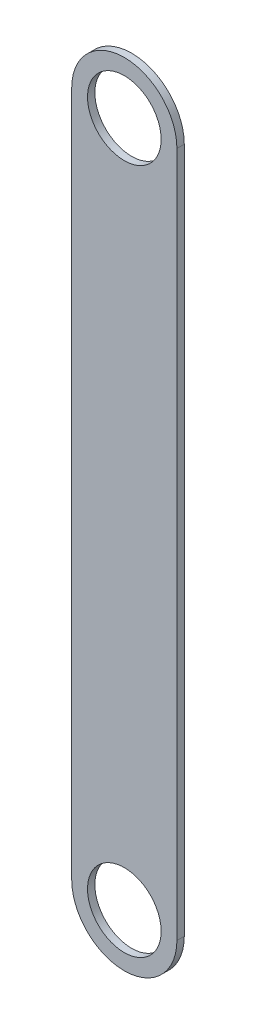
ISO-10303-21;
HEADER;
FILE_DESCRIPTION(('STEP AP214'),'2;1');
FILE_NAME('part.step','',(''),(''),'','','');
FILE_SCHEMA(('AUTOMOTIVE_DESIGN { 1 0 10303 214 1 1 1 1 }'));
ENDSEC;
DATA;
#1=APPLICATION_CONTEXT('core data for automotive mechanical design processes');
#2=APPLICATION_PROTOCOL_DEFINITION('international standard','automotive_design',2000,#1);
#3=PRODUCT_CONTEXT('',#1,'mechanical');
#4=PRODUCT('Part','Part','',(#3));
#5=PRODUCT_RELATED_PRODUCT_CATEGORY('part','',(#4));
#6=PRODUCT_DEFINITION_FORMATION('','',#4);
#7=PRODUCT_DEFINITION_CONTEXT('part definition',#1,'design');
#8=PRODUCT_DEFINITION('design','',#6,#7);
#9=PRODUCT_DEFINITION_SHAPE('','',#8);
#10=(LENGTH_UNIT() NAMED_UNIT(*) SI_UNIT(.MILLI.,.METRE.));
#11=(NAMED_UNIT(*) PLANE_ANGLE_UNIT() SI_UNIT($,.RADIAN.));
#12=(NAMED_UNIT(*) SI_UNIT($,.STERADIAN.) SOLID_ANGLE_UNIT());
#13=UNCERTAINTY_MEASURE_WITH_UNIT(LENGTH_MEASURE(1.E-05),#10,'distance_accuracy_value','');
#14=(GEOMETRIC_REPRESENTATION_CONTEXT(3) GLOBAL_UNCERTAINTY_ASSIGNED_CONTEXT((#13)) GLOBAL_UNIT_ASSIGNED_CONTEXT((#10,
#11,#12)) REPRESENTATION_CONTEXT('',''));
#15=CARTESIAN_POINT('',(0.,0.,0.));
#16=DIRECTION('',(0.,0.,1.));
#17=DIRECTION('',(1.,0.,0.));
#18=AXIS2_PLACEMENT_3D('',#15,#16,#17);
#19=CARTESIAN_POINT('',(124.81,-123.06,-0.045));
#20=DIRECTION('',(0.,0.,-1.));
#21=DIRECTION('',(0.,-1.,0.));
#22=AXIS2_PLACEMENT_3D('',#19,#20,#21);
#23=CYLINDRICAL_SURFACE('',#22,0.175);
#24=CARTESIAN_POINT('',(124.81,-123.06,-0.035));
#25=DIRECTION('',(0.,0.,-1.));
#26=DIRECTION('',(0.,-1.,0.));
#27=AXIS2_PLACEMENT_3D('',#24,#25,#26);
#28=CIRCLE('',#27,0.175);
#29=CARTESIAN_POINT('',(124.81,-123.235,-0.035));
#30=VERTEX_POINT('',#29);
#31=EDGE_CURVE('E139',#30,#30,#28,.T.);
#32=ORIENTED_EDGE('',*,*,#31,.T.);
#33=DIRECTION('',(0.,0.,1.));
#34=VECTOR('',#33,1.);
#35=CARTESIAN_POINT('',(124.81,-123.235,-0.045));
#36=LINE('',#35,#34);
#37=CARTESIAN_POINT('',(124.81,-123.235,0.));
#38=VERTEX_POINT('',#37);
#39=EDGE_CURVE('E11',#30,#38,#36,.T.);
#40=ORIENTED_EDGE('',*,*,#39,.T.);
#41=CARTESIAN_POINT('',(124.81,-123.06,0.));
#42=DIRECTION('',(0.,0.,-1.));
#43=DIRECTION('',(0.,-1.,0.));
#44=AXIS2_PLACEMENT_3D('',#41,#42,#43);
#45=CIRCLE('',#44,0.175);
#46=EDGE_CURVE('E145',#38,#38,#45,.T.);
#47=ORIENTED_EDGE('',*,*,#46,.F.);
#48=ORIENTED_EDGE('',*,*,#39,.F.);
#49=EDGE_LOOP('',(#32,#40,#47,#48));
#50=FACE_BOUND('',#49,.T.);
#51=ADVANCED_FACE('F17',(#50),#23,.F.);
#52=CARTESIAN_POINT('',(124.81,-126.32,-0.045));
#53=DIRECTION('',(0.,0.,-1.));
#54=DIRECTION('',(0.,-1.,0.));
#55=AXIS2_PLACEMENT_3D('',#52,#53,#54);
#56=CYLINDRICAL_SURFACE('',#55,0.175);
#57=CARTESIAN_POINT('',(124.81,-126.32,-0.035));
#58=DIRECTION('',(0.,0.,-1.));
#59=DIRECTION('',(0.,-1.,0.));
#60=AXIS2_PLACEMENT_3D('',#57,#58,#59);
#61=CIRCLE('',#60,0.175);
#62=CARTESIAN_POINT('',(124.81,-126.495,-0.035));
#63=VERTEX_POINT('',#62);
#64=EDGE_CURVE('E142',#63,#63,#61,.T.);
#65=ORIENTED_EDGE('',*,*,#64,.T.);
#66=DIRECTION('',(0.,0.,1.));
#67=VECTOR('',#66,1.);
#68=CARTESIAN_POINT('',(124.81,-126.495,-0.045));
#69=LINE('',#68,#67);
#70=CARTESIAN_POINT('',(124.81,-126.495,0.));
#71=VERTEX_POINT('',#70);
#72=EDGE_CURVE('E21',#63,#71,#69,.T.);
#73=ORIENTED_EDGE('',*,*,#72,.T.);
#74=CARTESIAN_POINT('',(124.81,-126.32,0.));
#75=DIRECTION('',(0.,0.,-1.));
#76=DIRECTION('',(0.,-1.,0.));
#77=AXIS2_PLACEMENT_3D('',#74,#75,#76);
#78=CIRCLE('',#77,0.175);
#79=EDGE_CURVE('E148',#71,#71,#78,.T.);
#80=ORIENTED_EDGE('',*,*,#79,.F.);
#81=ORIENTED_EDGE('',*,*,#72,.F.);
#82=EDGE_LOOP('',(#65,#73,#80,#81));
#83=FACE_BOUND('',#82,.T.);
#84=ADVANCED_FACE('F19',(#83),#56,.F.);
#85=CARTESIAN_POINT('',(124.56,-123.06,-0.035));
#86=DIRECTION('',(1.,0.,0.));
#87=DIRECTION('',(0.,1.,0.));
#88=AXIS2_PLACEMENT_3D('',#85,#86,#87);
#89=PLANE('',#88);
#90=DIRECTION('',(0.,-1.,0.));
#91=VECTOR('',#90,1.);
#92=CARTESIAN_POINT('',(124.56,-123.06,-0.035));
#93=LINE('',#92,#91);
#94=CARTESIAN_POINT('',(124.56,-123.06,-0.035));
#95=VERTEX_POINT('',#94);
#96=CARTESIAN_POINT('',(124.56,-126.32,-0.035));
#97=VERTEX_POINT('',#96);
#98=EDGE_CURVE('E59',#95,#97,#93,.T.);
#99=ORIENTED_EDGE('',*,*,#98,.T.);
#100=DIRECTION('',(0.,0.,1.));
#101=VECTOR('',#100,1.);
#102=CARTESIAN_POINT('',(124.56,-126.32,-0.035));
#103=LINE('',#102,#101);
#104=CARTESIAN_POINT('',(124.56,-126.32,0.));
#105=VERTEX_POINT('',#104);
#106=EDGE_CURVE('E111',#97,#105,#103,.T.);
#107=ORIENTED_EDGE('',*,*,#106,.T.);
#108=DIRECTION('',(0.,-1.,0.));
#109=VECTOR('',#108,1.);
#110=CARTESIAN_POINT('',(124.56,-123.06,0.));
#111=LINE('',#110,#109);
#112=CARTESIAN_POINT('',(124.56,-123.06,0.));
#113=VERTEX_POINT('',#112);
#114=EDGE_CURVE('E92',#113,#105,#111,.T.);
#115=ORIENTED_EDGE('',*,*,#114,.F.);
#116=DIRECTION('',(0.,0.,1.));
#117=VECTOR('',#116,1.);
#118=CARTESIAN_POINT('',(124.56,-123.06,-0.035));
#119=LINE('',#118,#117);
#120=EDGE_CURVE('E137',#95,#113,#119,.T.);
#121=ORIENTED_EDGE('',*,*,#120,.F.);
#122=EDGE_LOOP('',(#99,#107,#115,#121));
#123=FACE_BOUND('',#122,.T.);
#124=ADVANCED_FACE('F264',(#123),#89,.F.);
#125=CARTESIAN_POINT('',(125.06,-126.32,0.));
#126=DIRECTION('',(0.,0.,1.));
#127=DIRECTION('',(1.,0.,0.));
#128=AXIS2_PLACEMENT_3D('',#125,#126,#127);
#129=PLANE('',#128);
#130=ORIENTED_EDGE('',*,*,#46,.T.);
#131=EDGE_LOOP('',(#130));
#132=FACE_BOUND('',#131,.T.);
#133=ORIENTED_EDGE('',*,*,#79,.T.);
#134=EDGE_LOOP('',(#133));
#135=FACE_BOUND('',#134,.T.);
#136=DIRECTION('',(0.,1.,0.));
#137=VECTOR('',#136,1.);
#138=CARTESIAN_POINT('',(125.06,-126.32,0.));
#139=LINE('',#138,#137);
#140=CARTESIAN_POINT('',(125.06,-126.32,0.));
#141=VERTEX_POINT('',#140);
#142=CARTESIAN_POINT('',(125.06,-123.06,0.));
#143=VERTEX_POINT('',#142);
#144=EDGE_CURVE('E121',#141,#143,#139,.T.);
#145=ORIENTED_EDGE('',*,*,#144,.T.);
#146=CARTESIAN_POINT('',(124.81,-123.06,0.));
#147=DIRECTION('',(0.,0.,1.));
#148=DIRECTION('',(1.,0.,0.));
#149=AXIS2_PLACEMENT_3D('',#146,#147,#148);
#150=CIRCLE('',#149,0.25);
#151=EDGE_CURVE('E83',#143,#113,#150,.T.);
#152=ORIENTED_EDGE('',*,*,#151,.T.);
#153=ORIENTED_EDGE('',*,*,#114,.T.);
#154=CARTESIAN_POINT('',(124.81,-126.32,0.));
#155=DIRECTION('',(0.,0.,1.));
#156=DIRECTION('',(-1.,0.,0.));
#157=AXIS2_PLACEMENT_3D('',#154,#155,#156);
#158=CIRCLE('',#157,0.25);
#159=EDGE_CURVE('E70',#105,#141,#158,.T.);
#160=ORIENTED_EDGE('',*,*,#159,.T.);
#161=EDGE_LOOP('',(#145,#152,#153,#160));
#162=FACE_BOUND('',#161,.T.);
#163=ADVANCED_FACE('F167',(#132,#135,#162),#129,.T.);
#164=CARTESIAN_POINT('',(125.06,-126.32,-0.035));
#165=DIRECTION('',(0.,0.,1.));
#166=DIRECTION('',(1.,0.,0.));
#167=AXIS2_PLACEMENT_3D('',#164,#165,#166);
#168=PLANE('',#167);
#169=ORIENTED_EDGE('',*,*,#31,.F.);
#170=EDGE_LOOP('',(#169));
#171=FACE_BOUND('',#170,.T.);
#172=ORIENTED_EDGE('',*,*,#64,.F.);
#173=EDGE_LOOP('',(#172));
#174=FACE_BOUND('',#173,.T.);
#175=CARTESIAN_POINT('',(124.81,-126.32,-0.035));
#176=DIRECTION('',(0.,0.,1.));
#177=DIRECTION('',(-1.,0.,0.));
#178=AXIS2_PLACEMENT_3D('',#175,#176,#177);
#179=CIRCLE('',#178,0.25);
#180=CARTESIAN_POINT('',(125.06,-126.32,-0.035));
#181=VERTEX_POINT('',#180);
#182=EDGE_CURVE('E106',#97,#181,#179,.T.);
#183=ORIENTED_EDGE('',*,*,#182,.F.);
#184=ORIENTED_EDGE('',*,*,#98,.F.);
#185=CARTESIAN_POINT('',(124.81,-123.06,-0.035));
#186=DIRECTION('',(0.,0.,1.));
#187=DIRECTION('',(1.,0.,0.));
#188=AXIS2_PLACEMENT_3D('',#185,#186,#187);
#189=CIRCLE('',#188,0.25);
#190=CARTESIAN_POINT('',(125.06,-123.06,-0.035));
#191=VERTEX_POINT('',#190);
#192=EDGE_CURVE('E126',#191,#95,#189,.T.);
#193=ORIENTED_EDGE('',*,*,#192,.F.);
#194=DIRECTION('',(0.,1.,0.));
#195=VECTOR('',#194,1.);
#196=CARTESIAN_POINT('',(125.06,-126.32,-0.035));
#197=LINE('',#196,#195);
#198=EDGE_CURVE('E120',#181,#191,#197,.T.);
#199=ORIENTED_EDGE('',*,*,#198,.F.);
#200=EDGE_LOOP('',(#183,#184,#193,#199));
#201=FACE_BOUND('',#200,.T.);
#202=ADVANCED_FACE('F124',(#171,#174,#201),#168,.F.);
#203=CARTESIAN_POINT('',(124.81,-123.06,-0.035));
#204=DIRECTION('',(0.,0.,-1.));
#205=DIRECTION('',(1.,0.,0.));
#206=AXIS2_PLACEMENT_3D('',#203,#204,#205);
#207=CYLINDRICAL_SURFACE('',#206,0.25);
#208=ORIENTED_EDGE('',*,*,#192,.T.);
#209=ORIENTED_EDGE('',*,*,#120,.T.);
#210=ORIENTED_EDGE('',*,*,#151,.F.);
#211=DIRECTION('',(0.,0.,1.));
#212=VECTOR('',#211,1.);
#213=CARTESIAN_POINT('',(125.06,-123.06,-0.035));
#214=LINE('',#213,#212);
#215=EDGE_CURVE('E128',#191,#143,#214,.T.);
#216=ORIENTED_EDGE('',*,*,#215,.F.);
#217=EDGE_LOOP('',(#208,#209,#210,#216));
#218=FACE_BOUND('',#217,.T.);
#219=ADVANCED_FACE('F238',(#218),#207,.T.);
#220=CARTESIAN_POINT('',(124.81,-126.32,-0.035));
#221=DIRECTION('',(0.,0.,-1.));
#222=DIRECTION('',(-1.,0.,0.));
#223=AXIS2_PLACEMENT_3D('',#220,#221,#222);
#224=CYLINDRICAL_SURFACE('',#223,0.25);
#225=ORIENTED_EDGE('',*,*,#182,.T.);
#226=DIRECTION('',(0.,0.,1.));
#227=VECTOR('',#226,1.);
#228=CARTESIAN_POINT('',(125.06,-126.32,-0.035));
#229=LINE('',#228,#227);
#230=EDGE_CURVE('E109',#181,#141,#229,.T.);
#231=ORIENTED_EDGE('',*,*,#230,.T.);
#232=ORIENTED_EDGE('',*,*,#159,.F.);
#233=ORIENTED_EDGE('',*,*,#106,.F.);
#234=EDGE_LOOP('',(#225,#231,#232,#233));
#235=FACE_BOUND('',#234,.T.);
#236=ADVANCED_FACE('F108',(#235),#224,.T.);
#237=CARTESIAN_POINT('',(125.06,-126.32,-0.035));
#238=DIRECTION('',(-1.,0.,0.));
#239=DIRECTION('',(0.,0.,1.));
#240=AXIS2_PLACEMENT_3D('',#237,#238,#239);
#241=PLANE('',#240);
#242=ORIENTED_EDGE('',*,*,#198,.T.);
#243=ORIENTED_EDGE('',*,*,#215,.T.);
#244=ORIENTED_EDGE('',*,*,#144,.F.);
#245=ORIENTED_EDGE('',*,*,#230,.F.);
#246=EDGE_LOOP('',(#242,#243,#244,#245));
#247=FACE_BOUND('',#246,.T.);
#248=ADVANCED_FACE('F118',(#247),#241,.F.);
#249=CLOSED_SHELL('',(#51,#84,#124,#163,#202,#219,#236,#248));
#250=MANIFOLD_SOLID_BREP('B1',#249);
#251=ADVANCED_BREP_SHAPE_REPRESENTATION('',(#18,#250),#14);
#252=SHAPE_DEFINITION_REPRESENTATION(#9,#251);
ENDSEC;
END-ISO-10303-21;
